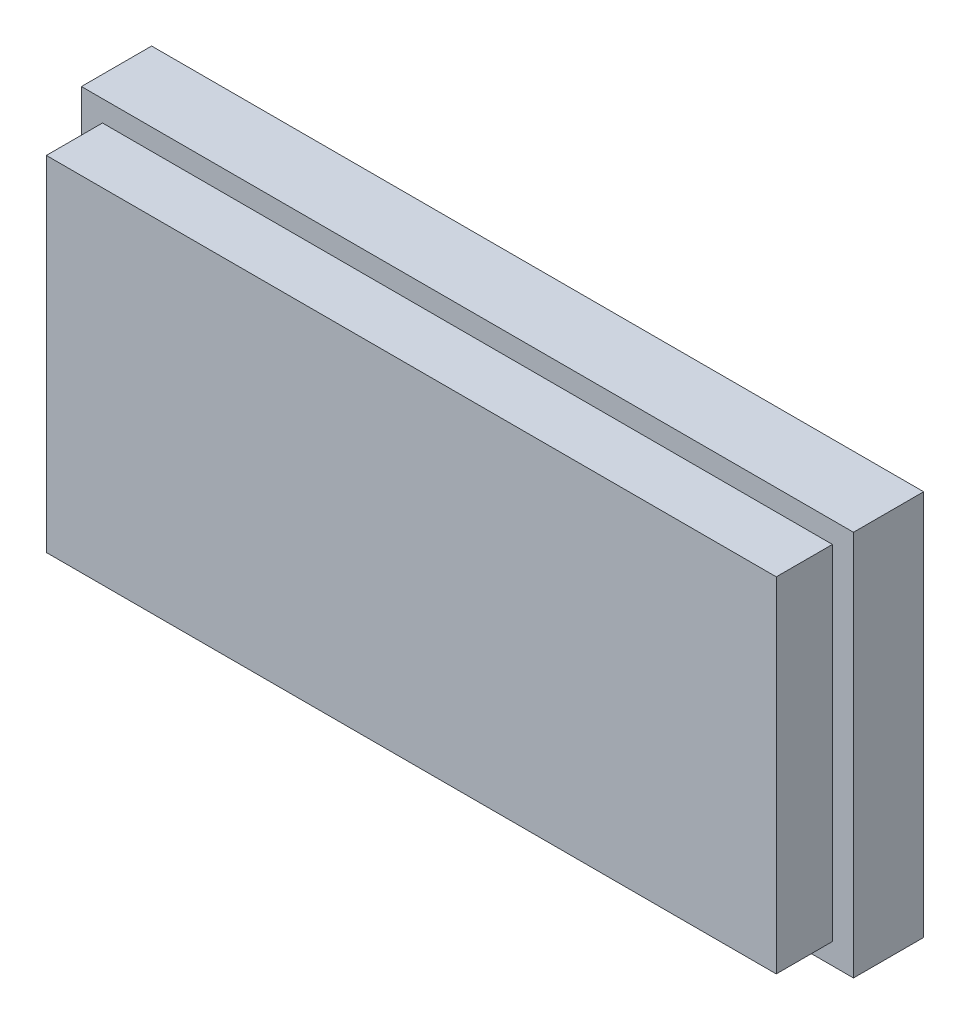
ISO-10303-21;
HEADER;
FILE_DESCRIPTION(('STEP AP214'),'2;1');
FILE_NAME('part.step','',(''),(''),'','','');
FILE_SCHEMA(('AUTOMOTIVE_DESIGN { 1 0 10303 214 1 1 1 1 }'));
ENDSEC;
DATA;
#1=APPLICATION_CONTEXT('core data for automotive mechanical design processes');
#2=APPLICATION_PROTOCOL_DEFINITION('international standard','automotive_design',2000,#1);
#3=PRODUCT_CONTEXT('',#1,'mechanical');
#4=PRODUCT('Part','Part','',(#3));
#5=PRODUCT_RELATED_PRODUCT_CATEGORY('part','',(#4));
#6=PRODUCT_DEFINITION_FORMATION('','',#4);
#7=PRODUCT_DEFINITION_CONTEXT('part definition',#1,'design');
#8=PRODUCT_DEFINITION('design','',#6,#7);
#9=PRODUCT_DEFINITION_SHAPE('','',#8);
#10=(LENGTH_UNIT() NAMED_UNIT(*) SI_UNIT(.MILLI.,.METRE.));
#11=(NAMED_UNIT(*) PLANE_ANGLE_UNIT() SI_UNIT($,.RADIAN.));
#12=(NAMED_UNIT(*) SI_UNIT($,.STERADIAN.) SOLID_ANGLE_UNIT());
#13=UNCERTAINTY_MEASURE_WITH_UNIT(LENGTH_MEASURE(1.E-05),#10,'distance_accuracy_value','');
#14=(GEOMETRIC_REPRESENTATION_CONTEXT(3) GLOBAL_UNCERTAINTY_ASSIGNED_CONTEXT((#13)) GLOBAL_UNIT_ASSIGNED_CONTEXT((#10,
#11,#12)) REPRESENTATION_CONTEXT('',''));
#15=CARTESIAN_POINT('',(0.,0.,0.));
#16=DIRECTION('',(0.,0.,1.));
#17=DIRECTION('',(1.,0.,0.));
#18=AXIS2_PLACEMENT_3D('',#15,#16,#17);
#19=CARTESIAN_POINT('',(-52.,-24.5,18.));
#20=DIRECTION('',(-1.,0.,0.));
#21=DIRECTION('',(0.,0.,1.));
#22=AXIS2_PLACEMENT_3D('',#19,#20,#21);
#23=PLANE('',#22);
#24=DIRECTION('',(0.,0.,-1.));
#25=VECTOR('',#24,1.);
#26=CARTESIAN_POINT('',(-52.,24.5,18.));
#27=LINE('',#26,#25);
#28=CARTESIAN_POINT('',(-52.,24.5,18.));
#29=VERTEX_POINT('',#28);
#30=CARTESIAN_POINT('',(-52.,24.5,10.));
#31=VERTEX_POINT('',#30);
#32=EDGE_CURVE('E48',#29,#31,#27,.T.);
#33=ORIENTED_EDGE('',*,*,#32,.T.);
#34=DIRECTION('',(0.,-1.,0.));
#35=VECTOR('',#34,1.);
#36=CARTESIAN_POINT('',(-52.,-24.5,10.));
#37=LINE('',#36,#35);
#38=CARTESIAN_POINT('',(-52.,-24.5,10.));
#39=VERTEX_POINT('',#38);
#40=EDGE_CURVE('E62',#31,#39,#37,.T.);
#41=ORIENTED_EDGE('',*,*,#40,.T.);
#42=DIRECTION('',(0.,0.,-1.));
#43=VECTOR('',#42,1.);
#44=CARTESIAN_POINT('',(-52.,-24.5,18.));
#45=LINE('',#44,#43);
#46=CARTESIAN_POINT('',(-52.,-24.5,18.));
#47=VERTEX_POINT('',#46);
#48=EDGE_CURVE('E11',#47,#39,#45,.T.);
#49=ORIENTED_EDGE('',*,*,#48,.F.);
#50=DIRECTION('',(0.,1.,0.));
#51=VECTOR('',#50,1.);
#52=CARTESIAN_POINT('',(-52.,-24.5,18.));
#53=LINE('',#52,#51);
#54=EDGE_CURVE('E144',#47,#29,#53,.T.);
#55=ORIENTED_EDGE('',*,*,#54,.T.);
#56=EDGE_LOOP('',(#33,#41,#49,#55));
#57=FACE_BOUND('',#56,.T.);
#58=ADVANCED_FACE('F45',(#57),#23,.T.);
#59=CARTESIAN_POINT('',(-52.,-24.5,18.));
#60=DIRECTION('',(0.,1.,0.));
#61=DIRECTION('',(0.,0.,1.));
#62=AXIS2_PLACEMENT_3D('',#59,#60,#61);
#63=PLANE('',#62);
#64=DIRECTION('',(1.,0.,0.));
#65=VECTOR('',#64,1.);
#66=CARTESIAN_POINT('',(-52.,-24.5,10.));
#67=LINE('',#66,#65);
#68=CARTESIAN_POINT('',(52.,-24.5,10.));
#69=VERTEX_POINT('',#68);
#70=EDGE_CURVE('E178',#39,#69,#67,.T.);
#71=ORIENTED_EDGE('',*,*,#70,.T.);
#72=DIRECTION('',(0.,0.,-1.));
#73=VECTOR('',#72,1.);
#74=CARTESIAN_POINT('',(52.,-24.5,18.));
#75=LINE('',#74,#73);
#76=CARTESIAN_POINT('',(52.,-24.5,18.));
#77=VERTEX_POINT('',#76);
#78=EDGE_CURVE('E54',#77,#69,#75,.T.);
#79=ORIENTED_EDGE('',*,*,#78,.F.);
#80=DIRECTION('',(1.,0.,0.));
#81=VECTOR('',#80,1.);
#82=CARTESIAN_POINT('',(-52.,-24.5,18.));
#83=LINE('',#82,#81);
#84=EDGE_CURVE('E135',#47,#77,#83,.T.);
#85=ORIENTED_EDGE('',*,*,#84,.F.);
#86=ORIENTED_EDGE('',*,*,#48,.T.);
#87=EDGE_LOOP('',(#71,#79,#85,#86));
#88=FACE_BOUND('',#87,.T.);
#89=ADVANCED_FACE('F194',(#88),#63,.F.);
#90=CARTESIAN_POINT('',(52.,-24.5,18.));
#91=DIRECTION('',(-1.,0.,0.));
#92=DIRECTION('',(0.,0.,1.));
#93=AXIS2_PLACEMENT_3D('',#90,#91,#92);
#94=PLANE('',#93);
#95=DIRECTION('',(0.,1.,0.));
#96=VECTOR('',#95,1.);
#97=CARTESIAN_POINT('',(52.,-24.5,10.));
#98=LINE('',#97,#96);
#99=CARTESIAN_POINT('',(52.,24.5,10.));
#100=VERTEX_POINT('',#99);
#101=EDGE_CURVE('E111',#69,#100,#98,.T.);
#102=ORIENTED_EDGE('',*,*,#101,.T.);
#103=DIRECTION('',(0.,0.,-1.));
#104=VECTOR('',#103,1.);
#105=CARTESIAN_POINT('',(52.,24.5,18.));
#106=LINE('',#105,#104);
#107=CARTESIAN_POINT('',(52.,24.5,18.));
#108=VERTEX_POINT('',#107);
#109=EDGE_CURVE('E123',#108,#100,#106,.T.);
#110=ORIENTED_EDGE('',*,*,#109,.F.);
#111=DIRECTION('',(0.,1.,0.));
#112=VECTOR('',#111,1.);
#113=CARTESIAN_POINT('',(52.,-24.5,18.));
#114=LINE('',#113,#112);
#115=EDGE_CURVE('E139',#77,#108,#114,.T.);
#116=ORIENTED_EDGE('',*,*,#115,.F.);
#117=ORIENTED_EDGE('',*,*,#78,.T.);
#118=EDGE_LOOP('',(#102,#110,#116,#117));
#119=FACE_BOUND('',#118,.T.);
#120=ADVANCED_FACE('F121',(#119),#94,.F.);
#121=CARTESIAN_POINT('',(-52.,24.5,18.));
#122=DIRECTION('',(0.,1.,0.));
#123=DIRECTION('',(0.,0.,1.));
#124=AXIS2_PLACEMENT_3D('',#121,#122,#123);
#125=PLANE('',#124);
#126=ORIENTED_EDGE('',*,*,#109,.T.);
#127=DIRECTION('',(-1.,0.,0.));
#128=VECTOR('',#127,1.);
#129=CARTESIAN_POINT('',(-52.,24.5,10.));
#130=LINE('',#129,#128);
#131=EDGE_CURVE('E108',#100,#31,#130,.T.);
#132=ORIENTED_EDGE('',*,*,#131,.T.);
#133=ORIENTED_EDGE('',*,*,#32,.F.);
#134=DIRECTION('',(1.,0.,0.));
#135=VECTOR('',#134,1.);
#136=CARTESIAN_POINT('',(-52.,24.5,18.));
#137=LINE('',#136,#135);
#138=EDGE_CURVE('E130',#29,#108,#137,.T.);
#139=ORIENTED_EDGE('',*,*,#138,.T.);
#140=EDGE_LOOP('',(#126,#132,#133,#139));
#141=FACE_BOUND('',#140,.T.);
#142=ADVANCED_FACE('F128',(#141),#125,.T.);
#143=CARTESIAN_POINT('',(0.,0.,18.));
#144=DIRECTION('',(0.,0.,-1.));
#145=DIRECTION('',(-1.,0.,0.));
#146=AXIS2_PLACEMENT_3D('',#143,#144,#145);
#147=PLANE('',#146);
#148=ORIENTED_EDGE('',*,*,#54,.F.);
#149=ORIENTED_EDGE('',*,*,#84,.T.);
#150=ORIENTED_EDGE('',*,*,#115,.T.);
#151=ORIENTED_EDGE('',*,*,#138,.F.);
#152=EDGE_LOOP('',(#148,#149,#150,#151));
#153=FACE_BOUND('',#152,.T.);
#154=ADVANCED_FACE('F197',(#153),#147,.F.);
#155=CARTESIAN_POINT('',(0.,0.,10.));
#156=DIRECTION('',(0.,0.,-1.));
#157=DIRECTION('',(-1.,0.,0.));
#158=AXIS2_PLACEMENT_3D('',#155,#156,#157);
#159=PLANE('',#158);
#160=DIRECTION('',(0.,1.,0.));
#161=VECTOR('',#160,1.);
#162=CARTESIAN_POINT('',(55.,-27.5,10.));
#163=LINE('',#162,#161);
#164=CARTESIAN_POINT('',(55.,-27.5,10.));
#165=VERTEX_POINT('',#164);
#166=CARTESIAN_POINT('',(55.,27.5,10.));
#167=VERTEX_POINT('',#166);
#168=EDGE_CURVE('E167',#165,#167,#163,.T.);
#169=ORIENTED_EDGE('',*,*,#168,.T.);
#170=DIRECTION('',(-1.,0.,0.));
#171=VECTOR('',#170,1.);
#172=CARTESIAN_POINT('',(-55.,27.5,10.));
#173=LINE('',#172,#171);
#174=CARTESIAN_POINT('',(-55.,27.5,10.));
#175=VERTEX_POINT('',#174);
#176=EDGE_CURVE('E184',#167,#175,#173,.T.);
#177=ORIENTED_EDGE('',*,*,#176,.T.);
#178=DIRECTION('',(0.,-1.,0.));
#179=VECTOR('',#178,1.);
#180=CARTESIAN_POINT('',(-55.,-27.5,10.));
#181=LINE('',#180,#179);
#182=CARTESIAN_POINT('',(-55.,-27.5,10.));
#183=VERTEX_POINT('',#182);
#184=EDGE_CURVE('E181',#175,#183,#181,.T.);
#185=ORIENTED_EDGE('',*,*,#184,.T.);
#186=DIRECTION('',(1.,0.,0.));
#187=VECTOR('',#186,1.);
#188=CARTESIAN_POINT('',(-55.,-27.5,10.));
#189=LINE('',#188,#187);
#190=EDGE_CURVE('E163',#183,#165,#189,.T.);
#191=ORIENTED_EDGE('',*,*,#190,.T.);
#192=EDGE_LOOP('',(#169,#177,#185,#191));
#193=FACE_BOUND('',#192,.T.);
#194=ORIENTED_EDGE('',*,*,#101,.F.);
#195=ORIENTED_EDGE('',*,*,#70,.F.);
#196=ORIENTED_EDGE('',*,*,#40,.F.);
#197=ORIENTED_EDGE('',*,*,#131,.F.);
#198=EDGE_LOOP('',(#194,#195,#196,#197));
#199=FACE_BOUND('',#198,.T.);
#200=ADVANCED_FACE('F110',(#193,#199),#159,.F.);
#201=CARTESIAN_POINT('',(55.,-27.5,10.));
#202=DIRECTION('',(-1.,0.,0.));
#203=DIRECTION('',(0.,0.,1.));
#204=AXIS2_PLACEMENT_3D('',#201,#202,#203);
#205=PLANE('',#204);
#206=DIRECTION('',(0.,1.,0.));
#207=VECTOR('',#206,1.);
#208=CARTESIAN_POINT('',(55.,-27.5,0.));
#209=LINE('',#208,#207);
#210=CARTESIAN_POINT('',(55.,-27.5,0.));
#211=VERTEX_POINT('',#210);
#212=CARTESIAN_POINT('',(55.,27.5,0.));
#213=VERTEX_POINT('',#212);
#214=EDGE_CURVE('E174',#211,#213,#209,.T.);
#215=ORIENTED_EDGE('',*,*,#214,.T.);
#216=DIRECTION('',(0.,0.,-1.));
#217=VECTOR('',#216,1.);
#218=CARTESIAN_POINT('',(55.,27.5,10.));
#219=LINE('',#218,#217);
#220=EDGE_CURVE('E147',#167,#213,#219,.T.);
#221=ORIENTED_EDGE('',*,*,#220,.F.);
#222=ORIENTED_EDGE('',*,*,#168,.F.);
#223=DIRECTION('',(0.,0.,-1.));
#224=VECTOR('',#223,1.);
#225=CARTESIAN_POINT('',(55.,-27.5,10.));
#226=LINE('',#225,#224);
#227=EDGE_CURVE('E159',#165,#211,#226,.T.);
#228=ORIENTED_EDGE('',*,*,#227,.T.);
#229=EDGE_LOOP('',(#215,#221,#222,#228));
#230=FACE_BOUND('',#229,.T.);
#231=ADVANCED_FACE('F204',(#230),#205,.F.);
#232=CARTESIAN_POINT('',(-55.,27.5,10.));
#233=DIRECTION('',(0.,-1.,0.));
#234=DIRECTION('',(0.,0.,-1.));
#235=AXIS2_PLACEMENT_3D('',#232,#233,#234);
#236=PLANE('',#235);
#237=DIRECTION('',(-1.,0.,0.));
#238=VECTOR('',#237,1.);
#239=CARTESIAN_POINT('',(-55.,27.5,0.));
#240=LINE('',#239,#238);
#241=CARTESIAN_POINT('',(-55.,27.5,0.));
#242=VERTEX_POINT('',#241);
#243=EDGE_CURVE('E171',#213,#242,#240,.T.);
#244=ORIENTED_EDGE('',*,*,#243,.T.);
#245=DIRECTION('',(0.,0.,-1.));
#246=VECTOR('',#245,1.);
#247=CARTESIAN_POINT('',(-55.,27.5,10.));
#248=LINE('',#247,#246);
#249=EDGE_CURVE('E151',#175,#242,#248,.T.);
#250=ORIENTED_EDGE('',*,*,#249,.F.);
#251=ORIENTED_EDGE('',*,*,#176,.F.);
#252=ORIENTED_EDGE('',*,*,#220,.T.);
#253=EDGE_LOOP('',(#244,#250,#251,#252));
#254=FACE_BOUND('',#253,.T.);
#255=ADVANCED_FACE('F241',(#254),#236,.F.);
#256=CARTESIAN_POINT('',(-55.,-27.5,10.));
#257=DIRECTION('',(1.,0.,0.));
#258=DIRECTION('',(0.,0.,-1.));
#259=AXIS2_PLACEMENT_3D('',#256,#257,#258);
#260=PLANE('',#259);
#261=DIRECTION('',(0.,-1.,0.));
#262=VECTOR('',#261,1.);
#263=CARTESIAN_POINT('',(-55.,-27.5,0.));
#264=LINE('',#263,#262);
#265=CARTESIAN_POINT('',(-55.,-27.5,0.));
#266=VERTEX_POINT('',#265);
#267=EDGE_CURVE('E168',#242,#266,#264,.T.);
#268=ORIENTED_EDGE('',*,*,#267,.T.);
#269=DIRECTION('',(0.,0.,-1.));
#270=VECTOR('',#269,1.);
#271=CARTESIAN_POINT('',(-55.,-27.5,10.));
#272=LINE('',#271,#270);
#273=EDGE_CURVE('E155',#183,#266,#272,.T.);
#274=ORIENTED_EDGE('',*,*,#273,.F.);
#275=ORIENTED_EDGE('',*,*,#184,.F.);
#276=ORIENTED_EDGE('',*,*,#249,.T.);
#277=EDGE_LOOP('',(#268,#274,#275,#276));
#278=FACE_BOUND('',#277,.T.);
#279=ADVANCED_FACE('F225',(#278),#260,.F.);
#280=CARTESIAN_POINT('',(-55.,-27.5,10.));
#281=DIRECTION('',(0.,1.,0.));
#282=DIRECTION('',(-1.,0.,0.));
#283=AXIS2_PLACEMENT_3D('',#280,#281,#282);
#284=PLANE('',#283);
#285=DIRECTION('',(1.,0.,0.));
#286=VECTOR('',#285,1.);
#287=CARTESIAN_POINT('',(-55.,-27.5,0.));
#288=LINE('',#287,#286);
#289=EDGE_CURVE('E164',#266,#211,#288,.T.);
#290=ORIENTED_EDGE('',*,*,#289,.T.);
#291=ORIENTED_EDGE('',*,*,#227,.F.);
#292=ORIENTED_EDGE('',*,*,#190,.F.);
#293=ORIENTED_EDGE('',*,*,#273,.T.);
#294=EDGE_LOOP('',(#290,#291,#292,#293));
#295=FACE_BOUND('',#294,.T.);
#296=ADVANCED_FACE('F220',(#295),#284,.F.);
#297=CARTESIAN_POINT('',(0.,0.,0.));
#298=DIRECTION('',(0.,0.,-1.));
#299=DIRECTION('',(-1.,0.,0.));
#300=AXIS2_PLACEMENT_3D('',#297,#298,#299);
#301=PLANE('',#300);
#302=ORIENTED_EDGE('',*,*,#214,.F.);
#303=ORIENTED_EDGE('',*,*,#289,.F.);
#304=ORIENTED_EDGE('',*,*,#267,.F.);
#305=ORIENTED_EDGE('',*,*,#243,.F.);
#306=EDGE_LOOP('',(#302,#303,#304,#305));
#307=FACE_BOUND('',#306,.T.);
#308=ADVANCED_FACE('F218',(#307),#301,.T.);
#309=CLOSED_SHELL('',(#58,#89,#120,#142,#154,#200,#231,#255,#279,#296,#308));
#310=MANIFOLD_SOLID_BREP('B2',#309);
#311=ADVANCED_BREP_SHAPE_REPRESENTATION('',(#18,#310),#14);
#312=SHAPE_DEFINITION_REPRESENTATION(#9,#311);
ENDSEC;
END-ISO-10303-21;
